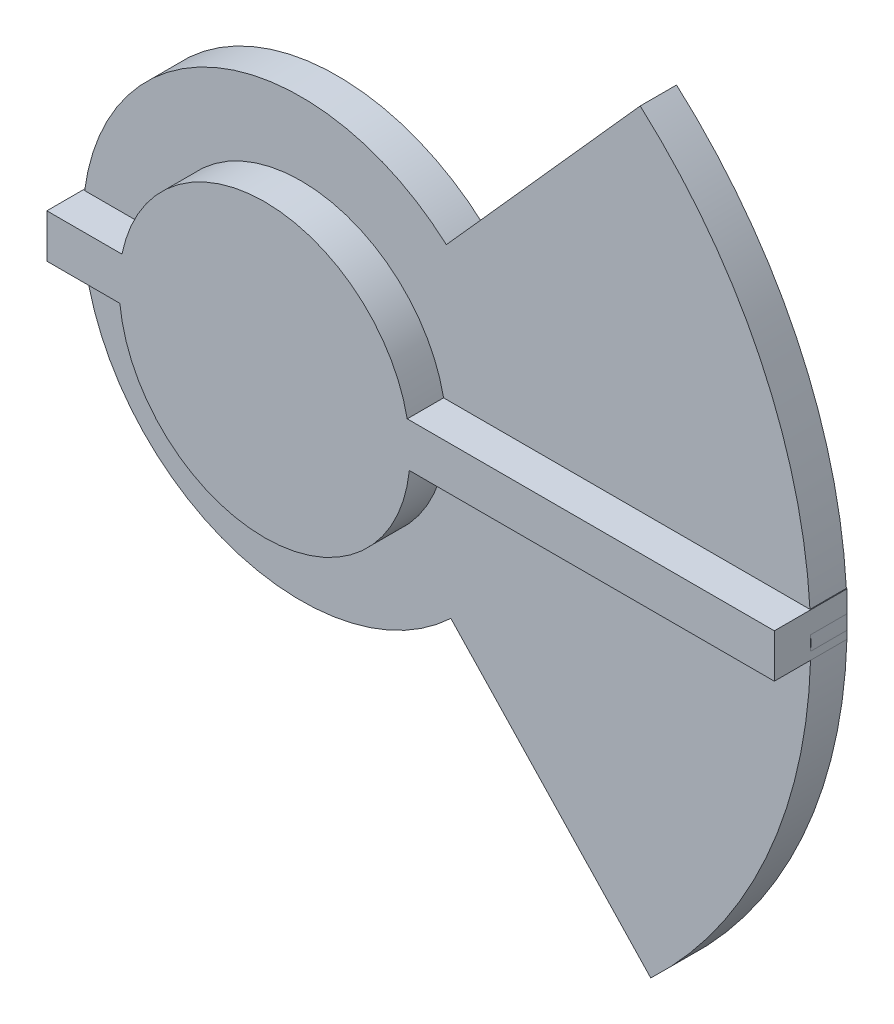
ISO-10303-21;
HEADER;
FILE_DESCRIPTION(('STEP AP214'),'2;1');
FILE_NAME('part.step','',(''),(''),'','','');
FILE_SCHEMA(('AUTOMOTIVE_DESIGN { 1 0 10303 214 1 1 1 1 }'));
ENDSEC;
DATA;
#1=APPLICATION_CONTEXT('core data for automotive mechanical design processes');
#2=APPLICATION_PROTOCOL_DEFINITION('international standard','automotive_design',2000,#1);
#3=PRODUCT_CONTEXT('',#1,'mechanical');
#4=PRODUCT('Part','Part','',(#3));
#5=PRODUCT_RELATED_PRODUCT_CATEGORY('part','',(#4));
#6=PRODUCT_DEFINITION_FORMATION('','',#4);
#7=PRODUCT_DEFINITION_CONTEXT('part definition',#1,'design');
#8=PRODUCT_DEFINITION('design','',#6,#7);
#9=PRODUCT_DEFINITION_SHAPE('','',#8);
#10=(LENGTH_UNIT() NAMED_UNIT(*) SI_UNIT(.MILLI.,.METRE.));
#11=(NAMED_UNIT(*) PLANE_ANGLE_UNIT() SI_UNIT($,.RADIAN.));
#12=(NAMED_UNIT(*) SI_UNIT($,.STERADIAN.) SOLID_ANGLE_UNIT());
#13=UNCERTAINTY_MEASURE_WITH_UNIT(LENGTH_MEASURE(1.E-05),#10,'distance_accuracy_value','');
#14=(GEOMETRIC_REPRESENTATION_CONTEXT(3) GLOBAL_UNCERTAINTY_ASSIGNED_CONTEXT((#13)) GLOBAL_UNIT_ASSIGNED_CONTEXT((#10,
#11,#12)) REPRESENTATION_CONTEXT('',''));
#15=CARTESIAN_POINT('',(0.,0.,0.));
#16=DIRECTION('',(0.,0.,1.));
#17=DIRECTION('',(1.,0.,0.));
#18=AXIS2_PLACEMENT_3D('',#15,#16,#17);
#19=CARTESIAN_POINT('',(-50.53596470636,2.73148630295261,10.));
#20=DIRECTION('',(1.,0.,0.));
#21=DIRECTION('',(0.,0.,-1.));
#22=AXIS2_PLACEMENT_3D('',#19,#20,#21);
#23=PLANE('',#22);
#24=DIRECTION('',(0.,0.,-1.));
#25=VECTOR('',#24,1.);
#26=CARTESIAN_POINT('',(-50.53596470636,0.828715757381616,5.));
#27=LINE('',#26,#25);
#28=CARTESIAN_POINT('',(-50.53596470636,0.828715757381616,5.));
#29=VERTEX_POINT('',#28);
#30=CARTESIAN_POINT('',(-50.53596470636,0.828715757381616,0.));
#31=VERTEX_POINT('',#30);
#32=EDGE_CURVE('E308',#29,#31,#27,.T.);
#33=ORIENTED_EDGE('',*,*,#32,.F.);
#34=DIRECTION('',(0.,-1.,0.));
#35=VECTOR('',#34,1.);
#36=CARTESIAN_POINT('',(-50.53596470636,2.73148630295261,5.));
#37=LINE('',#36,#35);
#38=CARTESIAN_POINT('',(-50.53596470636,-3.26851369704739,5.));
#39=VERTEX_POINT('',#38);
#40=EDGE_CURVE('E285',#29,#39,#37,.T.);
#41=ORIENTED_EDGE('',*,*,#40,.T.);
#42=DIRECTION('',(0.,0.,-1.));
#43=VECTOR('',#42,1.);
#44=CARTESIAN_POINT('',(-50.53596470636,-3.26851369704739,10.));
#45=LINE('',#44,#43);
#46=CARTESIAN_POINT('',(-50.53596470636,-3.26851369704739,10.));
#47=VERTEX_POINT('',#46);
#48=EDGE_CURVE('E350',#47,#39,#45,.T.);
#49=ORIENTED_EDGE('',*,*,#48,.F.);
#50=DIRECTION('',(0.,-1.,0.));
#51=VECTOR('',#50,1.);
#52=CARTESIAN_POINT('',(-50.53596470636,2.73148630295261,10.));
#53=LINE('',#52,#51);
#54=CARTESIAN_POINT('',(-50.53596470636,2.73148630295261,10.));
#55=VERTEX_POINT('',#54);
#56=EDGE_CURVE('E336',#55,#47,#53,.T.);
#57=ORIENTED_EDGE('',*,*,#56,.F.);
#58=DIRECTION('',(0.,0.,-1.));
#59=VECTOR('',#58,1.);
#60=CARTESIAN_POINT('',(-50.53596470636,2.73148630295261,10.));
#61=LINE('',#60,#59);
#62=CARTESIAN_POINT('',(-50.53596470636,2.73148630295261,0.));
#63=VERTEX_POINT('',#62);
#64=EDGE_CURVE('E372',#55,#63,#61,.T.);
#65=ORIENTED_EDGE('',*,*,#64,.T.);
#66=DIRECTION('',(0.,-1.,0.));
#67=VECTOR('',#66,1.);
#68=CARTESIAN_POINT('',(-50.53596470636,2.73148630295261,0.));
#69=LINE('',#68,#67);
#70=EDGE_CURVE('E354',#63,#31,#69,.T.);
#71=ORIENTED_EDGE('',*,*,#70,.T.);
#72=EDGE_LOOP('',(#33,#41,#49,#57,#65,#71));
#73=FACE_BOUND('',#72,.T.);
#74=ADVANCED_FACE('F83',(#73),#23,.F.);
#75=CARTESIAN_POINT('',(49.46403529364,2.73148630295263,10.));
#76=DIRECTION('',(0.,-1.,0.));
#77=DIRECTION('',(1.,0.,0.));
#78=AXIS2_PLACEMENT_3D('',#75,#76,#77);
#79=PLANE('',#78);
#80=DIRECTION('',(0.,0.,-1.));
#81=VECTOR('',#80,1.);
#82=CARTESIAN_POINT('',(-50.3446308788096,2.73148630295261,5.));
#83=LINE('',#82,#81);
#84=CARTESIAN_POINT('',(-50.3446308788096,2.73148630295261,0.));
#85=VERTEX_POINT('',#84);
#86=CARTESIAN_POINT('',(-50.3446308788096,2.73148630295261,5.));
#87=VERTEX_POINT('',#86);
#88=EDGE_CURVE('E12',#85,#87,#83,.F.);
#89=ORIENTED_EDGE('',*,*,#88,.F.);
#90=DIRECTION('',(-1.,0.,0.));
#91=VECTOR('',#90,1.);
#92=CARTESIAN_POINT('',(49.46403529364,2.73148630295263,0.));
#93=LINE('',#92,#91);
#94=EDGE_CURVE('E357',#85,#63,#93,.T.);
#95=ORIENTED_EDGE('',*,*,#94,.T.);
#96=ORIENTED_EDGE('',*,*,#64,.F.);
#97=DIRECTION('',(-1.,0.,0.));
#98=VECTOR('',#97,1.);
#99=CARTESIAN_POINT('',(49.46403529364,2.73148630295263,10.));
#100=LINE('',#99,#98);
#101=CARTESIAN_POINT('',(-40.2117720763197,2.73148630295261,10.));
#102=VERTEX_POINT('',#101);
#103=EDGE_CURVE('E341',#102,#55,#100,.T.);
#104=ORIENTED_EDGE('',*,*,#103,.F.);
#105=DIRECTION('',(0.,0.,-1.));
#106=VECTOR('',#105,1.);
#107=CARTESIAN_POINT('',(-40.2117720763197,2.73148630295261,10.));
#108=LINE('',#107,#106);
#109=CARTESIAN_POINT('',(-40.2117720763197,2.73148630295261,5.));
#110=VERTEX_POINT('',#109);
#111=EDGE_CURVE('E317',#102,#110,#108,.T.);
#112=ORIENTED_EDGE('',*,*,#111,.T.);
#113=DIRECTION('',(-1.,0.,0.));
#114=VECTOR('',#113,1.);
#115=CARTESIAN_POINT('',(49.46403529364,2.73148630295263,5.));
#116=LINE('',#115,#114);
#117=EDGE_CURVE('E282',#110,#87,#116,.T.);
#118=ORIENTED_EDGE('',*,*,#117,.T.);
#119=EDGE_LOOP('',(#89,#95,#96,#104,#112,#118));
#120=FACE_BOUND('',#119,.T.);
#121=ADVANCED_FACE('F396',(#120),#79,.F.);
#122=CARTESIAN_POINT('',(0.,0.,0.));
#123=DIRECTION('',(0.,0.,1.));
#124=DIRECTION('',(1.,0.,0.));
#125=AXIS2_PLACEMENT_3D('',#122,#123,#124);
#126=PLANE('',#125);
#127=ORIENTED_EDGE('',*,*,#94,.F.);
#128=CARTESIAN_POINT('',(-20.6059934785182,-1.21989896983291,0.));
#129=DIRECTION('',(0.,0.,1.));
#130=DIRECTION('',(1.,0.,0.));
#131=AXIS2_PLACEMENT_3D('',#128,#129,#130);
#132=CIRCLE('',#131,30.);
#133=CARTESIAN_POINT('',(-0.622690445764052,21.1557038131341,0.));
#134=VERTEX_POINT('',#133);
#135=EDGE_CURVE('E263',#134,#85,#132,.T.);
#136=ORIENTED_EDGE('',*,*,#135,.F.);
#137=DIRECTION('',(0.666110101091804,0.7458534260989,0.));
#138=VECTOR('',#137,1.);
#139=CARTESIAN_POINT('',(-10.8569884030868,9.69620757869084,0.));
#140=LINE('',#139,#138);
#141=CARTESIAN_POINT('',(26.0217135979081,50.9898408570901,0.));
#142=VERTEX_POINT('',#141);
#143=EDGE_CURVE('E257',#134,#142,#140,.T.);
#144=ORIENTED_EDGE('',*,*,#143,.T.);
#145=CARTESIAN_POINT('',(-20.3686663914693,-1.2165539205209,0.));
#146=DIRECTION('',(0.,0.,1.));
#147=DIRECTION('',(1.,0.,0.));
#148=AXIS2_PLACEMENT_3D('',#145,#146,#147);
#149=CIRCLE('',#148,69.8396378229054);
#150=CARTESIAN_POINT('',(49.3592906245543,2.73148630295263,0.));
#151=VERTEX_POINT('',#150);
#152=EDGE_CURVE('E217',#142,#151,#149,.F.);
#153=ORIENTED_EDGE('',*,*,#152,.T.);
#154=CARTESIAN_POINT('',(49.46403529364,2.73148630295263,0.));
#155=VERTEX_POINT('',#154);
#156=EDGE_CURVE('E358',#155,#151,#93,.T.);
#157=ORIENTED_EDGE('',*,*,#156,.F.);
#158=DIRECTION('',(0.,-1.,0.));
#159=VECTOR('',#158,1.);
#160=CARTESIAN_POINT('',(49.46403529364,2.73148630295263,0.));
#161=LINE('',#160,#159);
#162=CARTESIAN_POINT('',(49.46403529364,-0.232284347115188,0.));
#163=VERTEX_POINT('',#162);
#164=EDGE_CURVE('E362',#155,#163,#161,.T.);
#165=ORIENTED_EDGE('',*,*,#164,.T.);
#166=CARTESIAN_POINT('',(49.46403529364,-2.20082349392662,0.));
#167=VERTEX_POINT('',#166);
#168=EDGE_CURVE('E258',#163,#167,#149,.F.);
#169=ORIENTED_EDGE('',*,*,#168,.T.);
#170=CARTESIAN_POINT('',(49.46403529364,-3.26851369704737,0.));
#171=VERTEX_POINT('',#170);
#172=EDGE_CURVE('E361',#167,#171,#161,.T.);
#173=ORIENTED_EDGE('',*,*,#172,.T.);
#174=DIRECTION('',(-1.,0.,0.));
#175=VECTOR('',#174,1.);
#176=CARTESIAN_POINT('',(49.46403529364,-3.26851369704737,0.));
#177=LINE('',#176,#175);
#178=CARTESIAN_POINT('',(49.4408205878097,-3.26851369704737,0.));
#179=VERTEX_POINT('',#178);
#180=EDGE_CURVE('E312',#171,#179,#177,.T.);
#181=ORIENTED_EDGE('',*,*,#180,.T.);
#182=CARTESIAN_POINT('',(27.4746579713576,-52.0947548040814,0.));
#183=VERTEX_POINT('',#182);
#184=EDGE_CURVE('E259',#179,#183,#149,.F.);
#185=ORIENTED_EDGE('',*,*,#184,.T.);
#186=DIRECTION('',(0.686866449283939,-0.726783654774978,0.));
#187=VECTOR('',#186,1.);
#188=CARTESIAN_POINT('',(-11.4933617492112,-10.8621107851699,0.));
#189=LINE('',#188,#187);
#190=CARTESIAN_POINT('',(0.,-23.0234086130823,0.));
#191=VERTEX_POINT('',#190);
#192=EDGE_CURVE('E267',#191,#183,#189,.T.);
#193=ORIENTED_EDGE('',*,*,#192,.F.);
#194=EDGE_CURVE('E262',#31,#191,#132,.T.);
#195=ORIENTED_EDGE('',*,*,#194,.F.);
#196=ORIENTED_EDGE('',*,*,#70,.F.);
#197=EDGE_LOOP('',(#127,#136,#144,#153,#157,#165,#169,#173,#181,#185,#193,#195,#196));
#198=FACE_BOUND('',#197,.T.);
#199=ADVANCED_FACE('F389',(#198),#126,.F.);
#200=CARTESIAN_POINT('',(-20.6059934785182,-1.21989896983291,10.));
#201=DIRECTION('',(0.,0.,-1.));
#202=DIRECTION('',(-1.,0.,0.));
#203=AXIS2_PLACEMENT_3D('',#200,#201,#202);
#204=CYLINDRICAL_SURFACE('',#203,20.);
#205=DIRECTION('',(0.,0.,-1.));
#206=VECTOR('',#205,1.);
#207=CARTESIAN_POINT('',(-1.0002148807166,2.73148630295262,10.));
#208=LINE('',#207,#206);
#209=CARTESIAN_POINT('',(-1.0002148807166,2.73148630295262,10.));
#210=VERTEX_POINT('',#209);
#211=CARTESIAN_POINT('',(-1.0002148807166,2.73148630295262,5.));
#212=VERTEX_POINT('',#211);
#213=EDGE_CURVE('E322',#210,#212,#208,.T.);
#214=ORIENTED_EDGE('',*,*,#213,.T.);
#215=CARTESIAN_POINT('',(-20.6059934785182,-1.21989896983291,5.));
#216=DIRECTION('',(0.,0.,1.));
#217=DIRECTION('',(1.,0.,0.));
#218=AXIS2_PLACEMENT_3D('',#215,#216,#217);
#219=CIRCLE('',#218,20.);
#220=EDGE_CURVE('E223',#212,#110,#219,.T.);
#221=ORIENTED_EDGE('',*,*,#220,.T.);
#222=ORIENTED_EDGE('',*,*,#111,.F.);
#223=CARTESIAN_POINT('',(-20.6059934785182,-1.21989896983291,10.));
#224=DIRECTION('',(0.,0.,1.));
#225=DIRECTION('',(1.,0.,0.));
#226=AXIS2_PLACEMENT_3D('',#223,#224,#225);
#227=CIRCLE('',#226,20.);
#228=EDGE_CURVE('E313',#210,#102,#227,.T.);
#229=ORIENTED_EDGE('',*,*,#228,.F.);
#230=EDGE_LOOP('',(#214,#221,#222,#229));
#231=FACE_BOUND('',#230,.T.);
#232=ADVANCED_FACE('F401',(#231),#204,.T.);
#233=CARTESIAN_POINT('',(0.,0.,10.));
#234=DIRECTION('',(0.,0.,1.));
#235=DIRECTION('',(1.,0.,0.));
#236=AXIS2_PLACEMENT_3D('',#233,#234,#235);
#237=PLANE('',#236);
#238=ORIENTED_EDGE('',*,*,#228,.T.);
#239=ORIENTED_EDGE('',*,*,#103,.T.);
#240=ORIENTED_EDGE('',*,*,#56,.T.);
#241=DIRECTION('',(-1.,0.,0.));
#242=VECTOR('',#241,1.);
#243=CARTESIAN_POINT('',(49.46403529364,-3.26851369704737,10.));
#244=LINE('',#243,#242);
#245=CARTESIAN_POINT('',(-40.5007962596326,-3.26851369704739,10.));
#246=VERTEX_POINT('',#245);
#247=EDGE_CURVE('E337',#246,#47,#244,.T.);
#248=ORIENTED_EDGE('',*,*,#247,.F.);
#249=CARTESIAN_POINT('',(-20.6059934785182,-1.21989896983291,10.));
#250=DIRECTION('',(0.,0.,1.));
#251=DIRECTION('',(1.,0.,0.));
#252=AXIS2_PLACEMENT_3D('',#249,#250,#251);
#253=CIRCLE('',#252,20.);
#254=CARTESIAN_POINT('',(-0.711190697403691,-3.26851369704738,10.));
#255=VERTEX_POINT('',#254);
#256=EDGE_CURVE('E326',#246,#255,#253,.T.);
#257=ORIENTED_EDGE('',*,*,#256,.T.);
#258=CARTESIAN_POINT('',(49.46403529364,-3.26851369704737,10.));
#259=VERTEX_POINT('',#258);
#260=EDGE_CURVE('E332',#259,#255,#244,.T.);
#261=ORIENTED_EDGE('',*,*,#260,.F.);
#262=DIRECTION('',(0.,-1.,0.));
#263=VECTOR('',#262,1.);
#264=CARTESIAN_POINT('',(49.46403529364,2.73148630295263,10.));
#265=LINE('',#264,#263);
#266=CARTESIAN_POINT('',(49.46403529364,2.73148630295263,10.));
#267=VERTEX_POINT('',#266);
#268=EDGE_CURVE('E346',#267,#259,#265,.T.);
#269=ORIENTED_EDGE('',*,*,#268,.F.);
#270=EDGE_CURVE('E342',#267,#210,#100,.T.);
#271=ORIENTED_EDGE('',*,*,#270,.T.);
#272=EDGE_LOOP('',(#238,#239,#240,#248,#257,#261,#269,#271));
#273=FACE_BOUND('',#272,.T.);
#274=ADVANCED_FACE('F405',(#273),#237,.T.);
#275=CARTESIAN_POINT('',(-20.6059934785182,-1.21989896983291,10.));
#276=DIRECTION('',(0.,0.,-1.));
#277=DIRECTION('',(-1.,0.,0.));
#278=AXIS2_PLACEMENT_3D('',#275,#276,#277);
#279=CYLINDRICAL_SURFACE('',#278,20.);
#280=DIRECTION('',(0.,0.,-1.));
#281=VECTOR('',#280,1.);
#282=CARTESIAN_POINT('',(-40.5007962596326,-3.26851369704739,10.));
#283=LINE('',#282,#281);
#284=CARTESIAN_POINT('',(-40.5007962596326,-3.26851369704739,5.));
#285=VERTEX_POINT('',#284);
#286=EDGE_CURVE('E318',#246,#285,#283,.T.);
#287=ORIENTED_EDGE('',*,*,#286,.T.);
#288=CARTESIAN_POINT('',(-20.6059934785182,-1.21989896983291,5.));
#289=DIRECTION('',(0.,0.,1.));
#290=DIRECTION('',(1.,0.,0.));
#291=AXIS2_PLACEMENT_3D('',#288,#289,#290);
#292=CIRCLE('',#291,20.);
#293=CARTESIAN_POINT('',(-0.711190697403691,-3.26851369704738,5.));
#294=VERTEX_POINT('',#293);
#295=EDGE_CURVE('E290',#285,#294,#292,.T.);
#296=ORIENTED_EDGE('',*,*,#295,.T.);
#297=DIRECTION('',(0.,0.,-1.));
#298=VECTOR('',#297,1.);
#299=CARTESIAN_POINT('',(-0.711190697403691,-3.26851369704738,10.));
#300=LINE('',#299,#298);
#301=EDGE_CURVE('E330',#294,#255,#300,.F.);
#302=ORIENTED_EDGE('',*,*,#301,.T.);
#303=ORIENTED_EDGE('',*,*,#256,.F.);
#304=EDGE_LOOP('',(#287,#296,#302,#303));
#305=FACE_BOUND('',#304,.T.);
#306=ADVANCED_FACE('F440',(#305),#279,.T.);
#307=CARTESIAN_POINT('',(49.46403529364,-3.26851369704737,10.));
#308=DIRECTION('',(0.,-1.,0.));
#309=DIRECTION('',(1.,0.,0.));
#310=AXIS2_PLACEMENT_3D('',#307,#308,#309);
#311=PLANE('',#310);
#312=DIRECTION('',(-1.,0.,0.));
#313=VECTOR('',#312,1.);
#314=CARTESIAN_POINT('',(49.46403529364,-3.26851369704737,5.));
#315=LINE('',#314,#313);
#316=EDGE_CURVE('E99',#285,#39,#315,.T.);
#317=ORIENTED_EDGE('',*,*,#316,.F.);
#318=ORIENTED_EDGE('',*,*,#286,.F.);
#319=ORIENTED_EDGE('',*,*,#247,.T.);
#320=ORIENTED_EDGE('',*,*,#48,.T.);
#321=EDGE_LOOP('',(#317,#318,#319,#320));
#322=FACE_BOUND('',#321,.T.);
#323=ADVANCED_FACE('F85',(#322),#311,.T.);
#324=DIRECTION('',(0.,0.,-1.));
#325=VECTOR('',#324,1.);
#326=CARTESIAN_POINT('',(49.4408205878097,-3.26851369704737,5.));
#327=LINE('',#326,#325);
#328=CARTESIAN_POINT('',(49.4408205878097,-3.26851369704737,5.));
#329=VERTEX_POINT('',#328);
#330=EDGE_CURVE('E305',#179,#329,#327,.F.);
#331=ORIENTED_EDGE('',*,*,#330,.F.);
#332=ORIENTED_EDGE('',*,*,#180,.F.);
#333=DIRECTION('',(0.,0.,-1.));
#334=VECTOR('',#333,1.);
#335=CARTESIAN_POINT('',(49.46403529364,-3.26851369704737,10.));
#336=LINE('',#335,#334);
#337=EDGE_CURVE('E331',#259,#171,#336,.T.);
#338=ORIENTED_EDGE('',*,*,#337,.F.);
#339=ORIENTED_EDGE('',*,*,#260,.T.);
#340=ORIENTED_EDGE('',*,*,#301,.F.);
#341=DIRECTION('',(-1.,0.,0.));
#342=VECTOR('',#341,1.);
#343=CARTESIAN_POINT('',(49.46403529364,-3.26851369704737,5.));
#344=LINE('',#343,#342);
#345=EDGE_CURVE('E107',#329,#294,#344,.T.);
#346=ORIENTED_EDGE('',*,*,#345,.F.);
#347=EDGE_LOOP('',(#331,#332,#338,#339,#340,#346));
#348=FACE_BOUND('',#347,.T.);
#349=ADVANCED_FACE('F442',(#348),#311,.T.);
#350=CARTESIAN_POINT('',(49.46403529364,2.73148630295263,10.));
#351=DIRECTION('',(1.,0.,0.));
#352=DIRECTION('',(0.,0.,-1.));
#353=AXIS2_PLACEMENT_3D('',#350,#351,#352);
#354=PLANE('',#353);
#355=DIRECTION('',(0.,0.,-1.));
#356=VECTOR('',#355,1.);
#357=CARTESIAN_POINT('',(49.46403529364,-2.20082349392662,5.));
#358=LINE('',#357,#356);
#359=CARTESIAN_POINT('',(49.46403529364,-2.20082349392662,5.));
#360=VERTEX_POINT('',#359);
#361=EDGE_CURVE('E301',#360,#167,#358,.T.);
#362=ORIENTED_EDGE('',*,*,#361,.F.);
#363=DIRECTION('',(0.,-1.,0.));
#364=VECTOR('',#363,1.);
#365=CARTESIAN_POINT('',(49.46403529364,2.73148630295263,5.));
#366=LINE('',#365,#364);
#367=CARTESIAN_POINT('',(49.46403529364,-0.232284347115188,5.));
#368=VERTEX_POINT('',#367);
#369=EDGE_CURVE('E295',#368,#360,#366,.T.);
#370=ORIENTED_EDGE('',*,*,#369,.F.);
#371=DIRECTION('',(0.,0.,-1.));
#372=VECTOR('',#371,1.);
#373=CARTESIAN_POINT('',(49.46403529364,-0.232284347115188,5.));
#374=LINE('',#373,#372);
#375=EDGE_CURVE('E298',#163,#368,#374,.F.);
#376=ORIENTED_EDGE('',*,*,#375,.F.);
#377=ORIENTED_EDGE('',*,*,#164,.F.);
#378=DIRECTION('',(0.,0.,-1.));
#379=VECTOR('',#378,1.);
#380=CARTESIAN_POINT('',(49.46403529364,2.73148630295263,10.));
#381=LINE('',#380,#379);
#382=EDGE_CURVE('E369',#267,#155,#381,.T.);
#383=ORIENTED_EDGE('',*,*,#382,.F.);
#384=ORIENTED_EDGE('',*,*,#268,.T.);
#385=ORIENTED_EDGE('',*,*,#337,.T.);
#386=ORIENTED_EDGE('',*,*,#172,.F.);
#387=EDGE_LOOP('',(#362,#370,#376,#377,#383,#384,#385,#386));
#388=FACE_BOUND('',#387,.T.);
#389=ADVANCED_FACE('F409',(#388),#354,.T.);
#390=ORIENTED_EDGE('',*,*,#156,.T.);
#391=DIRECTION('',(0.,0.,-1.));
#392=VECTOR('',#391,1.);
#393=CARTESIAN_POINT('',(49.3592906245543,2.73148630295263,5.));
#394=LINE('',#393,#392);
#395=CARTESIAN_POINT('',(49.3592906245543,2.73148630295263,5.));
#396=VERTEX_POINT('',#395);
#397=EDGE_CURVE('E92',#151,#396,#394,.F.);
#398=ORIENTED_EDGE('',*,*,#397,.T.);
#399=DIRECTION('',(-1.,0.,0.));
#400=VECTOR('',#399,1.);
#401=CARTESIAN_POINT('',(49.46403529364,2.73148630295263,5.));
#402=LINE('',#401,#400);
#403=EDGE_CURVE('E234',#396,#212,#402,.T.);
#404=ORIENTED_EDGE('',*,*,#403,.T.);
#405=ORIENTED_EDGE('',*,*,#213,.F.);
#406=ORIENTED_EDGE('',*,*,#270,.F.);
#407=ORIENTED_EDGE('',*,*,#382,.T.);
#408=EDGE_LOOP('',(#390,#398,#404,#405,#406,#407));
#409=FACE_BOUND('',#408,.T.);
#410=ADVANCED_FACE('F385',(#409),#79,.F.);
#411=CARTESIAN_POINT('',(-10.8569884030868,9.69620757869084,5.));
#412=DIRECTION('',(-0.7458534260989,0.666110101091804,0.));
#413=DIRECTION('',(-0.666110101091804,-0.7458534260989,0.));
#414=AXIS2_PLACEMENT_3D('',#411,#412,#413);
#415=PLANE('',#414);
#416=ORIENTED_EDGE('',*,*,#143,.F.);
#417=DIRECTION('',(0.,0.,-1.));
#418=VECTOR('',#417,1.);
#419=CARTESIAN_POINT('',(-0.622690445764052,21.1557038131341,5.));
#420=LINE('',#419,#418);
#421=CARTESIAN_POINT('',(-0.622690445764052,21.1557038131341,5.));
#422=VERTEX_POINT('',#421);
#423=EDGE_CURVE('E224',#422,#134,#420,.T.);
#424=ORIENTED_EDGE('',*,*,#423,.F.);
#425=DIRECTION('',(0.666110101091804,0.7458534260989,0.));
#426=VECTOR('',#425,1.);
#427=CARTESIAN_POINT('',(-10.8569884030868,9.69620757869084,5.));
#428=LINE('',#427,#426);
#429=CARTESIAN_POINT('',(26.0217135979081,50.9898408570901,5.));
#430=VERTEX_POINT('',#429);
#431=EDGE_CURVE('E232',#422,#430,#428,.T.);
#432=ORIENTED_EDGE('',*,*,#431,.T.);
#433=DIRECTION('',(0.,0.,-1.));
#434=VECTOR('',#433,1.);
#435=CARTESIAN_POINT('',(26.0217135979081,50.9898408570901,5.));
#436=LINE('',#435,#434);
#437=EDGE_CURVE('E211',#430,#142,#436,.T.);
#438=ORIENTED_EDGE('',*,*,#437,.T.);
#439=EDGE_LOOP('',(#416,#424,#432,#438));
#440=FACE_BOUND('',#439,.T.);
#441=ADVANCED_FACE('F239',(#440),#415,.T.);
#442=CARTESIAN_POINT('',(0.,0.,5.));
#443=DIRECTION('',(0.,0.,1.));
#444=DIRECTION('',(1.,0.,0.));
#445=AXIS2_PLACEMENT_3D('',#442,#443,#444);
#446=PLANE('',#445);
#447=ORIENTED_EDGE('',*,*,#117,.F.);
#448=ORIENTED_EDGE('',*,*,#220,.F.);
#449=ORIENTED_EDGE('',*,*,#403,.F.);
#450=CARTESIAN_POINT('',(-20.3686663914693,-1.2165539205209,5.));
#451=DIRECTION('',(0.,0.,1.));
#452=DIRECTION('',(1.,0.,0.));
#453=AXIS2_PLACEMENT_3D('',#450,#451,#452);
#454=CIRCLE('',#453,69.8396378229054);
#455=EDGE_CURVE('E215',#430,#396,#454,.F.);
#456=ORIENTED_EDGE('',*,*,#455,.F.);
#457=ORIENTED_EDGE('',*,*,#431,.F.);
#458=CARTESIAN_POINT('',(-20.6059934785182,-1.21989896983291,5.));
#459=DIRECTION('',(0.,0.,1.));
#460=DIRECTION('',(1.,0.,0.));
#461=AXIS2_PLACEMENT_3D('',#458,#459,#460);
#462=CIRCLE('',#461,30.);
#463=EDGE_CURVE('E247',#422,#87,#462,.T.);
#464=ORIENTED_EDGE('',*,*,#463,.T.);
#465=EDGE_LOOP('',(#447,#448,#449,#456,#457,#464));
#466=FACE_BOUND('',#465,.T.);
#467=ADVANCED_FACE('F230',(#466),#446,.T.);
#468=CARTESIAN_POINT('',(-20.3686663914693,-1.2165539205209,5.));
#469=DIRECTION('',(0.,0.,-1.));
#470=DIRECTION('',(-1.,0.,0.));
#471=AXIS2_PLACEMENT_3D('',#468,#469,#470);
#472=CYLINDRICAL_SURFACE('',#471,69.8396378229054);
#473=ORIENTED_EDGE('',*,*,#397,.F.);
#474=ORIENTED_EDGE('',*,*,#152,.F.);
#475=ORIENTED_EDGE('',*,*,#437,.F.);
#476=ORIENTED_EDGE('',*,*,#455,.T.);
#477=EDGE_LOOP('',(#473,#474,#475,#476));
#478=FACE_BOUND('',#477,.T.);
#479=ADVANCED_FACE('F214',(#478),#472,.T.);
#480=CARTESIAN_POINT('',(-20.6059934785182,-1.21989896983291,5.));
#481=DIRECTION('',(0.,0.,-1.));
#482=DIRECTION('',(-1.,0.,0.));
#483=AXIS2_PLACEMENT_3D('',#480,#481,#482);
#484=CYLINDRICAL_SURFACE('',#483,30.);
#485=ORIENTED_EDGE('',*,*,#135,.T.);
#486=ORIENTED_EDGE('',*,*,#88,.T.);
#487=ORIENTED_EDGE('',*,*,#463,.F.);
#488=ORIENTED_EDGE('',*,*,#423,.T.);
#489=EDGE_LOOP('',(#485,#486,#487,#488));
#490=FACE_BOUND('',#489,.T.);
#491=ADVANCED_FACE('F394',(#490),#484,.T.);
#492=CARTESIAN_POINT('',(27.4746579713576,-52.0947548040814,5.));
#493=VERTEX_POINT('',#492);
#494=EDGE_CURVE('E238',#329,#493,#454,.F.);
#495=ORIENTED_EDGE('',*,*,#494,.F.);
#496=ORIENTED_EDGE('',*,*,#345,.T.);
#497=ORIENTED_EDGE('',*,*,#295,.F.);
#498=ORIENTED_EDGE('',*,*,#316,.T.);
#499=CARTESIAN_POINT('',(0.,-23.0234086130823,5.));
#500=VERTEX_POINT('',#499);
#501=EDGE_CURVE('E242',#39,#500,#462,.T.);
#502=ORIENTED_EDGE('',*,*,#501,.T.);
#503=DIRECTION('',(0.686866449283939,-0.726783654774978,0.));
#504=VECTOR('',#503,1.);
#505=CARTESIAN_POINT('',(-11.4933617492112,-10.8621107851699,5.));
#506=LINE('',#505,#504);
#507=EDGE_CURVE('E250',#500,#493,#506,.T.);
#508=ORIENTED_EDGE('',*,*,#507,.T.);
#509=EDGE_LOOP('',(#495,#496,#497,#498,#502,#508));
#510=FACE_BOUND('',#509,.T.);
#511=ADVANCED_FACE('F436',(#510),#446,.T.);
#512=CARTESIAN_POINT('',(-11.4933617492112,-10.8621107851699,5.));
#513=DIRECTION('',(0.726783654774978,0.686866449283939,0.));
#514=DIRECTION('',(-0.686866449283939,0.726783654774978,0.));
#515=AXIS2_PLACEMENT_3D('',#512,#513,#514);
#516=PLANE('',#515);
#517=ORIENTED_EDGE('',*,*,#192,.T.);
#518=DIRECTION('',(0.,0.,-1.));
#519=VECTOR('',#518,1.);
#520=CARTESIAN_POINT('',(27.4746579713576,-52.0947548040814,5.));
#521=LINE('',#520,#519);
#522=EDGE_CURVE('E254',#493,#183,#521,.T.);
#523=ORIENTED_EDGE('',*,*,#522,.F.);
#524=ORIENTED_EDGE('',*,*,#507,.F.);
#525=DIRECTION('',(0.,0.,-1.));
#526=VECTOR('',#525,1.);
#527=CARTESIAN_POINT('',(0.,-23.0234086130823,5.));
#528=LINE('',#527,#526);
#529=EDGE_CURVE('E274',#500,#191,#528,.T.);
#530=ORIENTED_EDGE('',*,*,#529,.T.);
#531=EDGE_LOOP('',(#517,#523,#524,#530));
#532=FACE_BOUND('',#531,.T.);
#533=ADVANCED_FACE('F476',(#532),#516,.F.);
#534=ORIENTED_EDGE('',*,*,#40,.F.);
#535=EDGE_CURVE('E245',#29,#39,#462,.T.);
#536=ORIENTED_EDGE('',*,*,#535,.T.);
#537=EDGE_LOOP('',(#534,#536));
#538=FACE_BOUND('',#537,.T.);
#539=ADVANCED_FACE('F427',(#538),#446,.T.);
#540=ORIENTED_EDGE('',*,*,#184,.F.);
#541=ORIENTED_EDGE('',*,*,#330,.T.);
#542=ORIENTED_EDGE('',*,*,#494,.T.);
#543=ORIENTED_EDGE('',*,*,#522,.T.);
#544=EDGE_LOOP('',(#540,#541,#542,#543));
#545=FACE_BOUND('',#544,.T.);
#546=ADVANCED_FACE('F471',(#545),#472,.T.);
#547=ORIENTED_EDGE('',*,*,#194,.T.);
#548=ORIENTED_EDGE('',*,*,#529,.F.);
#549=ORIENTED_EDGE('',*,*,#501,.F.);
#550=ORIENTED_EDGE('',*,*,#535,.F.);
#551=ORIENTED_EDGE('',*,*,#32,.T.);
#552=EDGE_LOOP('',(#547,#548,#549,#550,#551));
#553=FACE_BOUND('',#552,.T.);
#554=ADVANCED_FACE('F430',(#553),#484,.T.);
#555=EDGE_CURVE('E236',#368,#360,#454,.F.);
#556=ORIENTED_EDGE('',*,*,#555,.F.);
#557=ORIENTED_EDGE('',*,*,#369,.T.);
#558=EDGE_LOOP('',(#556,#557));
#559=FACE_BOUND('',#558,.T.);
#560=ADVANCED_FACE('F470',(#559),#446,.T.);
#561=ORIENTED_EDGE('',*,*,#555,.T.);
#562=ORIENTED_EDGE('',*,*,#361,.T.);
#563=ORIENTED_EDGE('',*,*,#168,.F.);
#564=ORIENTED_EDGE('',*,*,#375,.T.);
#565=EDGE_LOOP('',(#561,#562,#563,#564));
#566=FACE_BOUND('',#565,.T.);
#567=ADVANCED_FACE('F417',(#566),#472,.T.);
#568=CLOSED_SHELL('',(#74,#121,#199,#232,#274,#306,#323,#349,#389,#410,#441,#467,#479,#491,#511,
#533,#539,#546,#554,#560,#567));
#569=MANIFOLD_SOLID_BREP('B2',#568);
#570=ADVANCED_BREP_SHAPE_REPRESENTATION('',(#18,#569),#14);
#571=SHAPE_DEFINITION_REPRESENTATION(#9,#570);
ENDSEC;
END-ISO-10303-21;
